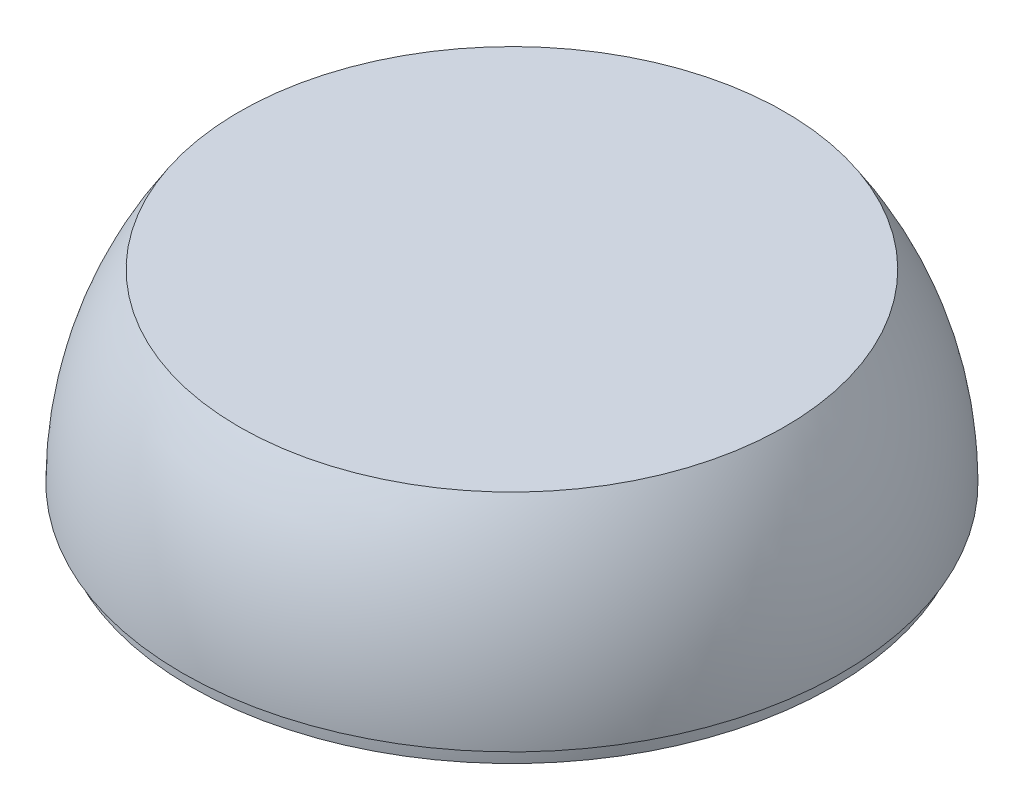
ISO-10303-21;
HEADER;
FILE_DESCRIPTION(('STEP AP214'),'2;1');
FILE_NAME('part.step','',(''),(''),'','','');
FILE_SCHEMA(('AUTOMOTIVE_DESIGN { 1 0 10303 214 1 1 1 1 }'));
ENDSEC;
DATA;
#1=APPLICATION_CONTEXT('core data for automotive mechanical design processes');
#2=APPLICATION_PROTOCOL_DEFINITION('international standard','automotive_design',2000,#1);
#3=PRODUCT_CONTEXT('',#1,'mechanical');
#4=PRODUCT('Part','Part','',(#3));
#5=PRODUCT_RELATED_PRODUCT_CATEGORY('part','',(#4));
#6=PRODUCT_DEFINITION_FORMATION('','',#4);
#7=PRODUCT_DEFINITION_CONTEXT('part definition',#1,'design');
#8=PRODUCT_DEFINITION('design','',#6,#7);
#9=PRODUCT_DEFINITION_SHAPE('','',#8);
#10=(LENGTH_UNIT() NAMED_UNIT(*) SI_UNIT(.MILLI.,.METRE.));
#11=(NAMED_UNIT(*) PLANE_ANGLE_UNIT() SI_UNIT($,.RADIAN.));
#12=(NAMED_UNIT(*) SI_UNIT($,.STERADIAN.) SOLID_ANGLE_UNIT());
#13=UNCERTAINTY_MEASURE_WITH_UNIT(LENGTH_MEASURE(1.E-05),#10,'distance_accuracy_value','');
#14=(GEOMETRIC_REPRESENTATION_CONTEXT(3) GLOBAL_UNCERTAINTY_ASSIGNED_CONTEXT((#13)) GLOBAL_UNIT_ASSIGNED_CONTEXT((#10,
#11,#12)) REPRESENTATION_CONTEXT('',''));
#15=CARTESIAN_POINT('',(0.,0.,0.));
#16=DIRECTION('',(0.,0.,1.));
#17=DIRECTION('',(1.,0.,0.));
#18=AXIS2_PLACEMENT_3D('',#15,#16,#17);
#19=CARTESIAN_POINT('',(41.,0.,0.));
#20=DIRECTION('',(0.,1.,0.));
#21=DIRECTION('',(-1.,0.,0.));
#22=AXIS2_PLACEMENT_3D('',#19,#20,#21);
#23=SPHERICAL_SURFACE('',#22,41.);
#24=CARTESIAN_POINT('',(41.,0.,0.));
#25=DIRECTION('',(0.,1.,0.));
#26=DIRECTION('',(0.,0.,1.));
#27=AXIS2_PLACEMENT_3D('',#24,#25,#26);
#28=CIRCLE('',#27,41.);
#29=CARTESIAN_POINT('',(41.,0.,41.));
#30=VERTEX_POINT('',#29);
#31=EDGE_CURVE('E10',#30,#30,#28,.T.);
#32=ORIENTED_EDGE('',*,*,#31,.T.);
#33=EDGE_LOOP('',(#32));
#34=FACE_BOUND('',#33,.T.);
#35=CARTESIAN_POINT('',(41.,23.,0.));
#36=DIRECTION('',(0.,1.,0.));
#37=DIRECTION('',(0.,0.,1.));
#38=AXIS2_PLACEMENT_3D('',#35,#36,#37);
#39=CIRCLE('',#38,33.9411254969543);
#40=CARTESIAN_POINT('',(41.,23.,33.9411254969543));
#41=VERTEX_POINT('',#40);
#42=EDGE_CURVE('E66',#41,#41,#39,.T.);
#43=ORIENTED_EDGE('',*,*,#42,.F.);
#44=EDGE_LOOP('',(#43));
#45=FACE_BOUND('',#44,.T.);
#46=ADVANCED_FACE('F39',(#34,#45),#23,.T.);
#47=CARTESIAN_POINT('',(0.,0.,0.));
#48=DIRECTION('',(0.,-1.,0.));
#49=DIRECTION('',(0.,0.,-1.));
#50=AXIS2_PLACEMENT_3D('',#47,#48,#49);
#51=PLANE('',#50);
#52=CARTESIAN_POINT('',(41.,0.,0.));
#53=DIRECTION('',(0.,1.,0.));
#54=DIRECTION('',(0.,0.,1.));
#55=AXIS2_PLACEMENT_3D('',#52,#53,#54);
#56=CIRCLE('',#55,40.);
#57=CARTESIAN_POINT('',(41.,0.,40.));
#58=VERTEX_POINT('',#57);
#59=EDGE_CURVE('E46',#58,#58,#56,.T.);
#60=ORIENTED_EDGE('',*,*,#59,.T.);
#61=EDGE_LOOP('',(#60));
#62=FACE_BOUND('',#61,.T.);
#63=ORIENTED_EDGE('',*,*,#31,.F.);
#64=EDGE_LOOP('',(#63));
#65=FACE_BOUND('',#64,.T.);
#66=ADVANCED_FACE('F74',(#62,#65),#51,.T.);
#67=CARTESIAN_POINT('',(41.,0.,0.));
#68=DIRECTION('',(0.,1.,0.));
#69=DIRECTION('',(-1.,0.,0.));
#70=AXIS2_PLACEMENT_3D('',#67,#68,#69);
#71=SPHERICAL_SURFACE('',#70,40.);
#72=CARTESIAN_POINT('',(41.,-1.99999999999999,0.));
#73=DIRECTION('',(0.,1.,0.));
#74=DIRECTION('',(0.,0.,1.));
#75=AXIS2_PLACEMENT_3D('',#72,#73,#74);
#76=CIRCLE('',#75,39.9499687108764);
#77=CARTESIAN_POINT('',(41.,-1.99999999999999,39.9499687108764));
#78=VERTEX_POINT('',#77);
#79=EDGE_CURVE('E51',#78,#78,#76,.T.);
#80=ORIENTED_EDGE('',*,*,#79,.T.);
#81=EDGE_LOOP('',(#80));
#82=FACE_BOUND('',#81,.T.);
#83=ORIENTED_EDGE('',*,*,#59,.F.);
#84=EDGE_LOOP('',(#83));
#85=FACE_BOUND('',#84,.T.);
#86=ADVANCED_FACE('F78',(#82,#85),#71,.T.);
#87=CARTESIAN_POINT('',(2.05131581169911,-1.99999999999999,0.));
#88=DIRECTION('',(0.,-1.,0.));
#89=DIRECTION('',(0.,0.,-1.));
#90=AXIS2_PLACEMENT_3D('',#87,#88,#89);
#91=PLANE('',#90);
#92=CARTESIAN_POINT('',(41.,-2.,0.));
#93=DIRECTION('',(0.,1.,0.));
#94=DIRECTION('',(0.,0.,1.));
#95=AXIS2_PLACEMENT_3D('',#92,#93,#94);
#96=CIRCLE('',#95,38.9486841883009);
#97=CARTESIAN_POINT('',(2.05131581169911,-2.,0.));
#98=VERTEX_POINT('',#97);
#99=EDGE_CURVE('E56',#98,#98,#96,.T.);
#100=ORIENTED_EDGE('',*,*,#99,.T.);
#101=EDGE_LOOP('',(#100));
#102=FACE_BOUND('',#101,.T.);
#103=ORIENTED_EDGE('',*,*,#79,.F.);
#104=EDGE_LOOP('',(#103));
#105=FACE_BOUND('',#104,.T.);
#106=ADVANCED_FACE('F82',(#102,#105),#91,.T.);
#107=CARTESIAN_POINT('',(41.,0.,0.));
#108=DIRECTION('',(0.,1.,0.));
#109=DIRECTION('',(-1.,0.,0.));
#110=AXIS2_PLACEMENT_3D('',#107,#108,#109);
#111=SPHERICAL_SURFACE('',#110,39.);
#112=CARTESIAN_POINT('',(41.,21.,0.));
#113=DIRECTION('',(0.,1.,0.));
#114=DIRECTION('',(0.,0.,1.));
#115=AXIS2_PLACEMENT_3D('',#112,#113,#114);
#116=CIRCLE('',#115,32.86335345031);
#117=CARTESIAN_POINT('',(8.13664654969004,21.,0.));
#118=VERTEX_POINT('',#117);
#119=EDGE_CURVE('E62',#118,#118,#116,.T.);
#120=CARTESIAN_POINT('',(8.13664654969004,21.,0.));
#121=CARTESIAN_POINT('',(8.00103989474358,20.7877868279745,0.));
#122=CARTESIAN_POINT('',(7.86748932420293,20.5742598112618,0.));
#123=CARTESIAN_POINT('',(7.60454923867882,20.1446589737613,0.));
#124=CARTESIAN_POINT('',(7.47515972369534,19.9285851529735,0.));
#125=CARTESIAN_POINT('',(7.22059063603107,19.4939715926224,0.));
#126=CARTESIAN_POINT('',(7.09541106335027,19.275431853059,0.));
#127=CARTESIAN_POINT('',(6.84930874873315,18.8359685219491,0.));
#128=CARTESIAN_POINT('',(6.72838600679683,18.6150449304026,0.));
#129=CARTESIAN_POINT('',(6.4908427567387,18.170896788101,0.));
#130=CARTESIAN_POINT('',(6.37422224861689,17.9476722373458,0.));
#131=CARTESIAN_POINT('',(6.14532722469285,17.4990059512821,0.));
#132=CARTESIAN_POINT('',(6.03305270889062,17.2735642159736,0.));
#133=CARTESIAN_POINT('',(5.81289180521446,16.8205481625878,0.));
#134=CARTESIAN_POINT('',(5.70500541734053,16.5929738445104,0.));
#135=CARTESIAN_POINT('',(5.49366125621475,16.1357780289978,0.));
#136=CARTESIAN_POINT('',(5.39020348296289,15.9061565315627,0.));
#137=CARTESIAN_POINT('',(5.18775537640103,15.444952528649,0.));
#138=CARTESIAN_POINT('',(5.08876504309103,15.2133700231704,0.));
#139=CARTESIAN_POINT('',(4.89528896505579,14.7483309114976,0.));
#140=CARTESIAN_POINT('',(4.80080322033056,14.5148743053035,0.));
#141=CARTESIAN_POINT('',(4.61637177768619,14.0461746028069,0.));
#142=CARTESIAN_POINT('',(4.52642607976707,13.8109315065044,0.));
#143=CARTESIAN_POINT('',(4.35110848517549,13.3387471048315,0.));
#144=CARTESIAN_POINT('',(4.26573658850305,13.1018057994611,0.));
#145=CARTESIAN_POINT('',(4.0995986344115,12.6263138979877,0.));
#146=CARTESIAN_POINT('',(4.01883257699241,12.3877633018847,0.));
#147=CARTESIAN_POINT('',(3.86193661095347,11.90914234121,0.));
#148=CARTESIAN_POINT('',(3.78580670233363,11.6690719766382,0.));
#149=CARTESIAN_POINT('',(3.63821160360491,11.1875015716216,0.));
#150=CARTESIAN_POINT('',(3.56674641349603,10.9460015311769,0.));
#151=CARTESIAN_POINT('',(3.42850757094497,10.4616624035332,0.));
#152=CARTESIAN_POINT('',(3.36173391850279,10.2188233163342,0.));
#153=CARTESIAN_POINT('',(3.23290320982035,9.73189722681252,0.));
#154=CARTESIAN_POINT('',(3.1708461535801,9.48781022448979,0.));
#155=CARTESIAN_POINT('',(3.05147192581236,8.99847990466342,0.));
#156=CARTESIAN_POINT('',(2.99415475428488,8.75323658715978,0.));
#157=CARTESIAN_POINT('',(2.88428180568959,8.26168567085152,0.));
#158=CARTESIAN_POINT('',(2.83172602862178,8.01537807204689,0.));
#159=CARTESIAN_POINT('',(2.73139559185659,7.5217910264156,0.));
#160=CARTESIAN_POINT('',(2.6836209321592,7.27451157958893,0.));
#161=CARTESIAN_POINT('',(2.59287065880824,6.77907363590352,0.));
#162=CARTESIAN_POINT('',(2.54989504515466,6.53091513904478,0.));
#163=CARTESIAN_POINT('',(2.46875899159801,6.03381222317138,0.));
#164=CARTESIAN_POINT('',(2.43059855169492,5.78486780415672,0.));
#165=CARTESIAN_POINT('',(2.35910716633125,5.28628646678529,0.));
#166=CARTESIAN_POINT('',(2.32577622087065,5.03664954842852,0.));
#167=CARTESIAN_POINT('',(2.26395633267862,4.53677689506452,0.));
#168=CARTESIAN_POINT('',(2.23546738994718,4.28654116005728,0.));
#169=CARTESIAN_POINT('',(2.1833421984623,3.78556478080691,0.));
#170=CARTESIAN_POINT('',(2.15970594970886,3.53482413656379,0.));
#171=CARTESIAN_POINT('',(2.11729501614881,3.03293203573065,0.));
#172=CARTESIAN_POINT('',(2.09852033134221,2.78178057914063,0.));
#173=CARTESIAN_POINT('',(2.06583957189464,2.27916110469228,0.));
#174=CARTESIAN_POINT('',(2.05193349725368,2.02769308683393,0.));
#175=CARTESIAN_POINT('',(2.0289951747572,1.52453485964452,0.));
#176=CARTESIAN_POINT('',(2.01996292690168,1.27284465031346,0.));
#177=CARTESIAN_POINT('',(2.00677565499933,0.769336493658596,0.));
#178=CARTESIAN_POINT('',(2.0026206309525,0.517518546334801,0.));
#179=CARTESIAN_POINT('',(1.99918933818368,0.0138494139869579,0.));
#180=CARTESIAN_POINT('',(1.9999130694617,-0.238001771037091,0.));
#181=CARTESIAN_POINT('',(2.00623911935957,-0.741642861822994,0.));
#182=CARTESIAN_POINT('',(2.01184143797943,-0.993432767584849,0.));
#183=CARTESIAN_POINT('',(2.02792217344693,-1.49685682154272,0.));
#184=CARTESIAN_POINT('',(2.03840059029458,-1.74849096973873,0.));
#185=CARTESIAN_POINT('',(2.05131581169911,-2.,0.));
#186=B_SPLINE_CURVE_WITH_KNOTS('',3,(#120,#121,#122,#123,#124,#125,#126,#127,#128,#129,#130,
#131,#132,#133,#134,#135,#136,#137,#138,#139,#140,#141,#142,#143,#144,#145,#146,#147,#148,#149,
#150,#151,#152,#153,#154,#155,#156,#157,#158,#159,#160,#161,#162,#163,#164,#165,#166,#167,#168,
#169,#170,#171,#172,#173,#174,#175,#176,#177,#178,#179,#180,#181,#182,#183,#184,#185),
.UNSPECIFIED.,.F.,.F.,(4,2,2,2,2,2,2,2,2,2,2,2,2,2,2,2,2,2,2,2,2,2,2,2,2,2,2,2,2,2,2,2,4),(0.,
0.755509416160037,1.51101883232007,2.26652824848011,3.02203766464015,3.77754708080019,
4.53305649696022,5.28856591312026,6.0440753292803,6.79958474544033,7.55509416160037,
8.31060357776041,9.06611299392044,9.82162241008048,10.5771318262405,11.3326412424006,
12.0881506585606,12.8436600747206,13.5991694908807,14.3546789070407,15.1101883232007,
15.8656977393608,16.6212071555208,17.3767165716808,18.1322259878409,18.8877354040009,
19.643244820161,20.398754236321,21.154263652481,21.9097730686411,22.6652824848011,
23.4207919009611,24.1763013171212),.UNSPECIFIED.);
#187=EDGE_CURVE('BSEAM89',#118,#98,#186,.T.);
#188=ORIENTED_EDGE('',*,*,#119,.T.);
#189=ORIENTED_EDGE('',*,*,#99,.F.);
#190=ORIENTED_EDGE('',*,*,#187,.T.);
#191=ORIENTED_EDGE('',*,*,#187,.F.);
#192=EDGE_LOOP('',(#188,#190,#189,#191));
#193=FACE_BOUND('',#192,.T.);
#194=ADVANCED_FACE('F89',(#193),#111,.F.);
#195=CARTESIAN_POINT('',(41.,21.,0.));
#196=DIRECTION('',(0.,-1.,0.));
#197=DIRECTION('',(0.,0.,-1.));
#198=AXIS2_PLACEMENT_3D('',#195,#196,#197);
#199=PLANE('',#198);
#200=ORIENTED_EDGE('',*,*,#119,.F.);
#201=EDGE_LOOP('',(#200));
#202=FACE_BOUND('',#201,.T.);
#203=ADVANCED_FACE('F93',(#202),#199,.T.);
#204=CARTESIAN_POINT('',(41.,23.,0.));
#205=DIRECTION('',(0.,1.,0.));
#206=DIRECTION('',(0.,0.,1.));
#207=AXIS2_PLACEMENT_3D('',#204,#205,#206);
#208=PLANE('',#207);
#209=ORIENTED_EDGE('',*,*,#42,.T.);
#210=EDGE_LOOP('',(#209));
#211=FACE_BOUND('',#210,.T.);
#212=ADVANCED_FACE('F71',(#211),#208,.T.);
#213=CLOSED_SHELL('',(#46,#66,#86,#106,#194,#203,#212));
#214=MANIFOLD_SOLID_BREP('B2',#213);
#215=ADVANCED_BREP_SHAPE_REPRESENTATION('',(#18,#214),#14);
#216=SHAPE_DEFINITION_REPRESENTATION(#9,#215);
ENDSEC;
END-ISO-10303-21;
